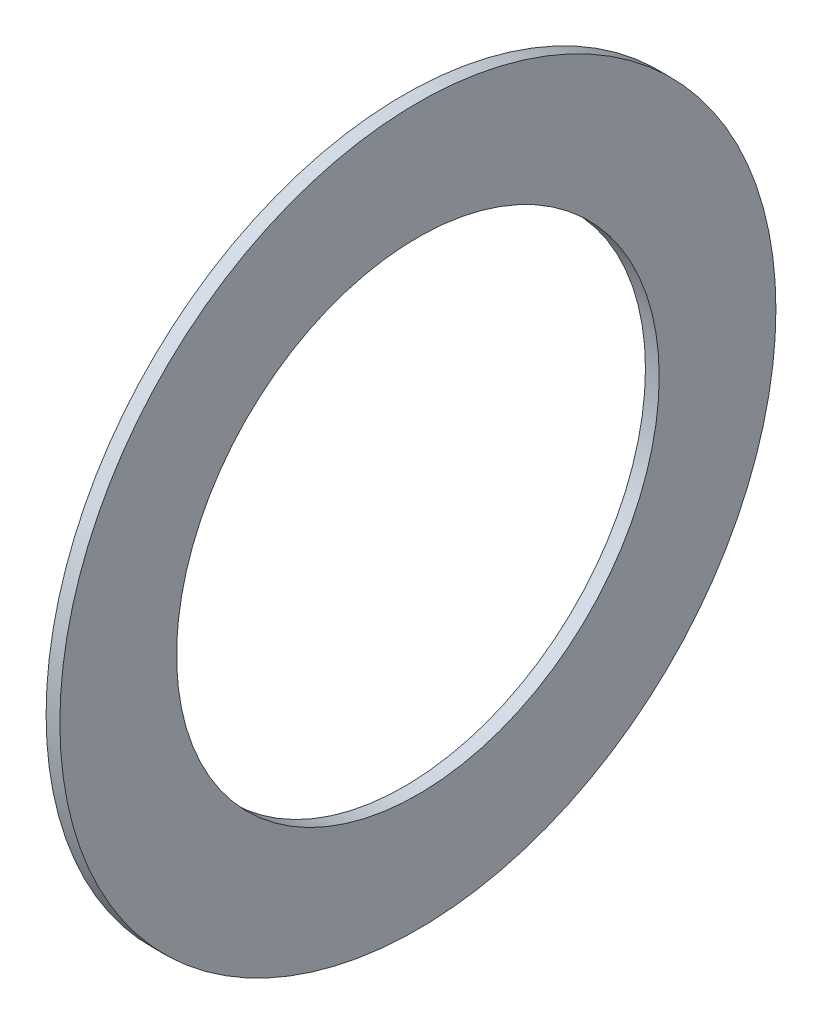
ISO-10303-21;
HEADER;
FILE_DESCRIPTION(('STEP AP214'),'2;1');
FILE_NAME('part.step','',(''),(''),'','','');
FILE_SCHEMA(('AUTOMOTIVE_DESIGN { 1 0 10303 214 1 1 1 1 }'));
ENDSEC;
DATA;
#1=APPLICATION_CONTEXT('core data for automotive mechanical design processes');
#2=APPLICATION_PROTOCOL_DEFINITION('international standard','automotive_design',2000,#1);
#3=PRODUCT_CONTEXT('',#1,'mechanical');
#4=PRODUCT('Part','Part','',(#3));
#5=PRODUCT_RELATED_PRODUCT_CATEGORY('part','',(#4));
#6=PRODUCT_DEFINITION_FORMATION('','',#4);
#7=PRODUCT_DEFINITION_CONTEXT('part definition',#1,'design');
#8=PRODUCT_DEFINITION('design','',#6,#7);
#9=PRODUCT_DEFINITION_SHAPE('','',#8);
#10=(LENGTH_UNIT() NAMED_UNIT(*) SI_UNIT(.MILLI.,.METRE.));
#11=(NAMED_UNIT(*) PLANE_ANGLE_UNIT() SI_UNIT($,.RADIAN.));
#12=(NAMED_UNIT(*) SI_UNIT($,.STERADIAN.) SOLID_ANGLE_UNIT());
#13=UNCERTAINTY_MEASURE_WITH_UNIT(LENGTH_MEASURE(1.E-05),#10,'distance_accuracy_value','');
#14=(GEOMETRIC_REPRESENTATION_CONTEXT(3) GLOBAL_UNCERTAINTY_ASSIGNED_CONTEXT((#13)) GLOBAL_UNIT_ASSIGNED_CONTEXT((#10,
#11,#12)) REPRESENTATION_CONTEXT('',''));
#15=CARTESIAN_POINT('',(0.,0.,0.));
#16=DIRECTION('',(0.,0.,1.));
#17=DIRECTION('',(1.,0.,0.));
#18=AXIS2_PLACEMENT_3D('',#15,#16,#17);
#19=CARTESIAN_POINT('',(0.499999999999976,0.,0.));
#20=DIRECTION('',(1.,0.,0.));
#21=DIRECTION('',(0.,0.,-1.));
#22=AXIS2_PLACEMENT_3D('',#19,#20,#21);
#23=PLANE('',#22);
#24=CARTESIAN_POINT('',(0.499999999999976,0.,0.));
#25=DIRECTION('',(1.,0.,0.));
#26=DIRECTION('',(0.,0.,-1.));
#27=AXIS2_PLACEMENT_3D('',#24,#25,#26);
#28=CIRCLE('',#27,26.);
#29=CARTESIAN_POINT('',(0.499999999999976,0.,-26.));
#30=VERTEX_POINT('',#29);
#31=EDGE_CURVE('E10',#30,#30,#28,.T.);
#32=ORIENTED_EDGE('',*,*,#31,.T.);
#33=EDGE_LOOP('',(#32));
#34=FACE_BOUND('',#33,.T.);
#35=CARTESIAN_POINT('',(0.499999999999976,0.,0.));
#36=DIRECTION('',(1.,0.,0.));
#37=DIRECTION('',(0.,0.,-1.));
#38=AXIS2_PLACEMENT_3D('',#35,#36,#37);
#39=CIRCLE('',#38,17.525);
#40=CARTESIAN_POINT('',(0.499999999999976,0.,-17.525));
#41=VERTEX_POINT('',#40);
#42=EDGE_CURVE('E37',#41,#41,#39,.T.);
#43=ORIENTED_EDGE('',*,*,#42,.F.);
#44=EDGE_LOOP('',(#43));
#45=FACE_BOUND('',#44,.T.);
#46=ADVANCED_FACE('F30',(#34,#45),#23,.T.);
#47=CARTESIAN_POINT('',(0.499999999999976,0.,0.));
#48=DIRECTION('',(-1.,0.,0.));
#49=DIRECTION('',(0.,0.,1.));
#50=AXIS2_PLACEMENT_3D('',#47,#48,#49);
#51=CYLINDRICAL_SURFACE('',#50,26.);
#52=ORIENTED_EDGE('',*,*,#31,.F.);
#53=EDGE_LOOP('',(#52));
#54=FACE_BOUND('',#53,.T.);
#55=CARTESIAN_POINT('',(-0.500000000000025,0.,0.));
#56=DIRECTION('',(1.,0.,0.));
#57=DIRECTION('',(0.,0.,-1.));
#58=AXIS2_PLACEMENT_3D('',#55,#56,#57);
#59=CIRCLE('',#58,26.);
#60=CARTESIAN_POINT('',(-0.500000000000025,0.,-26.));
#61=VERTEX_POINT('',#60);
#62=EDGE_CURVE('E41',#61,#61,#59,.T.);
#63=ORIENTED_EDGE('',*,*,#62,.T.);
#64=EDGE_LOOP('',(#63));
#65=FACE_BOUND('',#64,.T.);
#66=ADVANCED_FACE('F32',(#54,#65),#51,.T.);
#67=CARTESIAN_POINT('',(0.499999999999976,0.,0.));
#68=DIRECTION('',(-1.,0.,0.));
#69=DIRECTION('',(0.,0.,1.));
#70=AXIS2_PLACEMENT_3D('',#67,#68,#69);
#71=CYLINDRICAL_SURFACE('',#70,17.525);
#72=ORIENTED_EDGE('',*,*,#42,.T.);
#73=EDGE_LOOP('',(#72));
#74=FACE_BOUND('',#73,.T.);
#75=CARTESIAN_POINT('',(-0.500000000000025,0.,0.));
#76=DIRECTION('',(1.,0.,0.));
#77=DIRECTION('',(0.,0.,-1.));
#78=AXIS2_PLACEMENT_3D('',#75,#76,#77);
#79=CIRCLE('',#78,17.525);
#80=CARTESIAN_POINT('',(-0.500000000000025,0.,-17.525));
#81=VERTEX_POINT('',#80);
#82=EDGE_CURVE('E45',#81,#81,#79,.T.);
#83=ORIENTED_EDGE('',*,*,#82,.F.);
#84=EDGE_LOOP('',(#83));
#85=FACE_BOUND('',#84,.T.);
#86=ADVANCED_FACE('F54',(#74,#85),#71,.F.);
#87=CARTESIAN_POINT('',(-0.500000000000025,0.,0.));
#88=DIRECTION('',(1.,0.,0.));
#89=DIRECTION('',(0.,0.,-1.));
#90=AXIS2_PLACEMENT_3D('',#87,#88,#89);
#91=PLANE('',#90);
#92=ORIENTED_EDGE('',*,*,#82,.T.);
#93=EDGE_LOOP('',(#92));
#94=FACE_BOUND('',#93,.T.);
#95=ORIENTED_EDGE('',*,*,#62,.F.);
#96=EDGE_LOOP('',(#95));
#97=FACE_BOUND('',#96,.T.);
#98=ADVANCED_FACE('F51',(#94,#97),#91,.F.);
#99=CLOSED_SHELL('',(#46,#66,#86,#98));
#100=MANIFOLD_SOLID_BREP('B2',#99);
#101=ADVANCED_BREP_SHAPE_REPRESENTATION('',(#18,#100),#14);
#102=SHAPE_DEFINITION_REPRESENTATION(#9,#101);
ENDSEC;
END-ISO-10303-21;
